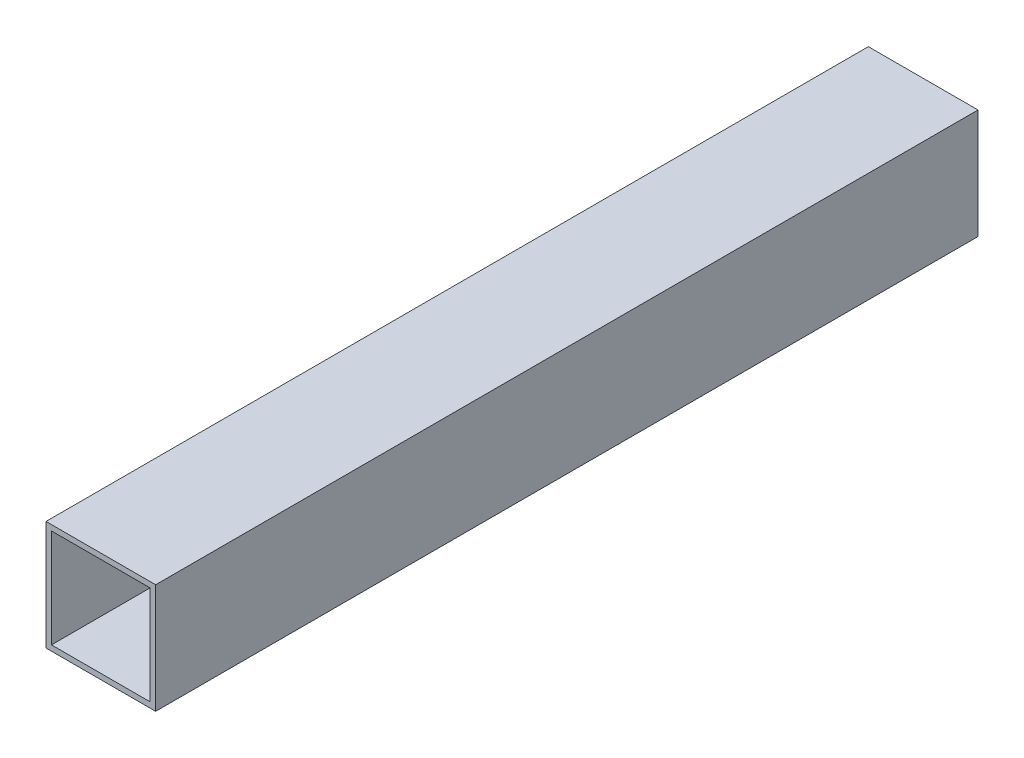
ISO-10303-21;
HEADER;
FILE_DESCRIPTION(('STEP AP214'),'2;1');
FILE_NAME('part.step','',(''),(''),'','','');
FILE_SCHEMA(('AUTOMOTIVE_DESIGN { 1 0 10303 214 1 1 1 1 }'));
ENDSEC;
DATA;
#1=APPLICATION_CONTEXT('core data for automotive mechanical design processes');
#2=APPLICATION_PROTOCOL_DEFINITION('international standard','automotive_design',2000,#1);
#3=PRODUCT_CONTEXT('',#1,'mechanical');
#4=PRODUCT('Part','Part','',(#3));
#5=PRODUCT_RELATED_PRODUCT_CATEGORY('part','',(#4));
#6=PRODUCT_DEFINITION_FORMATION('','',#4);
#7=PRODUCT_DEFINITION_CONTEXT('part definition',#1,'design');
#8=PRODUCT_DEFINITION('design','',#6,#7);
#9=PRODUCT_DEFINITION_SHAPE('','',#8);
#10=(LENGTH_UNIT() NAMED_UNIT(*) SI_UNIT(.MILLI.,.METRE.));
#11=(NAMED_UNIT(*) PLANE_ANGLE_UNIT() SI_UNIT($,.RADIAN.));
#12=(NAMED_UNIT(*) SI_UNIT($,.STERADIAN.) SOLID_ANGLE_UNIT());
#13=UNCERTAINTY_MEASURE_WITH_UNIT(LENGTH_MEASURE(1.E-05),#10,'distance_accuracy_value','');
#14=(GEOMETRIC_REPRESENTATION_CONTEXT(3) GLOBAL_UNCERTAINTY_ASSIGNED_CONTEXT((#13)) GLOBAL_UNIT_ASSIGNED_CONTEXT((#10,
#11,#12)) REPRESENTATION_CONTEXT('',''));
#15=CARTESIAN_POINT('',(0.,0.,0.));
#16=DIRECTION('',(0.,0.,1.));
#17=DIRECTION('',(1.,0.,0.));
#18=AXIS2_PLACEMENT_3D('',#15,#16,#17);
#19=CARTESIAN_POINT('',(0.,0.,150.));
#20=DIRECTION('',(0.,0.,-1.));
#21=DIRECTION('',(-1.,0.,0.));
#22=AXIS2_PLACEMENT_3D('',#19,#20,#21);
#23=PLANE('',#22);
#24=DIRECTION('',(0.,1.,0.));
#25=VECTOR('',#24,1.);
#26=CARTESIAN_POINT('',(10.,-10.,150.));
#27=LINE('',#26,#25);
#28=CARTESIAN_POINT('',(10.,-10.,150.));
#29=VERTEX_POINT('',#28);
#30=CARTESIAN_POINT('',(10.,10.,150.));
#31=VERTEX_POINT('',#30);
#32=EDGE_CURVE('E159',#29,#31,#27,.T.);
#33=ORIENTED_EDGE('',*,*,#32,.T.);
#34=DIRECTION('',(-1.,0.,0.));
#35=VECTOR('',#34,1.);
#36=CARTESIAN_POINT('',(-10.,10.,150.));
#37=LINE('',#36,#35);
#38=CARTESIAN_POINT('',(-10.,10.,150.));
#39=VERTEX_POINT('',#38);
#40=EDGE_CURVE('E163',#31,#39,#37,.T.);
#41=ORIENTED_EDGE('',*,*,#40,.T.);
#42=DIRECTION('',(0.,-1.,0.));
#43=VECTOR('',#42,1.);
#44=CARTESIAN_POINT('',(-10.,-10.,150.));
#45=LINE('',#44,#43);
#46=CARTESIAN_POINT('',(-10.,-10.,150.));
#47=VERTEX_POINT('',#46);
#48=EDGE_CURVE('E167',#39,#47,#45,.T.);
#49=ORIENTED_EDGE('',*,*,#48,.T.);
#50=DIRECTION('',(1.,0.,0.));
#51=VECTOR('',#50,1.);
#52=CARTESIAN_POINT('',(-10.,-10.,150.));
#53=LINE('',#52,#51);
#54=EDGE_CURVE('E170',#47,#29,#53,.T.);
#55=ORIENTED_EDGE('',*,*,#54,.T.);
#56=EDGE_LOOP('',(#33,#41,#49,#55));
#57=FACE_BOUND('',#56,.T.);
#58=DIRECTION('',(0.,-1.,0.));
#59=VECTOR('',#58,1.);
#60=CARTESIAN_POINT('',(-9.,-9.,150.));
#61=LINE('',#60,#59);
#62=CARTESIAN_POINT('',(-9.,9.,150.));
#63=VERTEX_POINT('',#62);
#64=CARTESIAN_POINT('',(-9.,-9.,150.));
#65=VERTEX_POINT('',#64);
#66=EDGE_CURVE('E111',#63,#65,#61,.T.);
#67=ORIENTED_EDGE('',*,*,#66,.F.);
#68=DIRECTION('',(-1.,0.,0.));
#69=VECTOR('',#68,1.);
#70=CARTESIAN_POINT('',(-9.,9.,150.));
#71=LINE('',#70,#69);
#72=CARTESIAN_POINT('',(9.,9.,150.));
#73=VERTEX_POINT('',#72);
#74=EDGE_CURVE('E137',#73,#63,#71,.T.);
#75=ORIENTED_EDGE('',*,*,#74,.F.);
#76=DIRECTION('',(0.,1.,0.));
#77=VECTOR('',#76,1.);
#78=CARTESIAN_POINT('',(9.,-9.,150.));
#79=LINE('',#78,#77);
#80=CARTESIAN_POINT('',(9.,-9.,150.));
#81=VERTEX_POINT('',#80);
#82=EDGE_CURVE('E133',#81,#73,#79,.T.);
#83=ORIENTED_EDGE('',*,*,#82,.F.);
#84=DIRECTION('',(1.,0.,0.));
#85=VECTOR('',#84,1.);
#86=CARTESIAN_POINT('',(-9.,-9.,150.));
#87=LINE('',#86,#85);
#88=EDGE_CURVE('E120',#65,#81,#87,.T.);
#89=ORIENTED_EDGE('',*,*,#88,.F.);
#90=EDGE_LOOP('',(#67,#75,#83,#89));
#91=FACE_BOUND('',#90,.T.);
#92=ADVANCED_FACE('F45',(#57,#91),#23,.F.);
#93=CARTESIAN_POINT('',(0.,0.,0.));
#94=DIRECTION('',(0.,0.,-1.));
#95=DIRECTION('',(-1.,0.,0.));
#96=AXIS2_PLACEMENT_3D('',#93,#94,#95);
#97=PLANE('',#96);
#98=DIRECTION('',(0.,1.,0.));
#99=VECTOR('',#98,1.);
#100=CARTESIAN_POINT('',(10.,-10.,0.));
#101=LINE('',#100,#99);
#102=CARTESIAN_POINT('',(10.,-10.,0.));
#103=VERTEX_POINT('',#102);
#104=CARTESIAN_POINT('',(10.,10.,0.));
#105=VERTEX_POINT('',#104);
#106=EDGE_CURVE('E129',#103,#105,#101,.T.);
#107=ORIENTED_EDGE('',*,*,#106,.F.);
#108=DIRECTION('',(1.,0.,0.));
#109=VECTOR('',#108,1.);
#110=CARTESIAN_POINT('',(-10.,-10.,0.));
#111=LINE('',#110,#109);
#112=CARTESIAN_POINT('',(-10.,-10.,0.));
#113=VERTEX_POINT('',#112);
#114=EDGE_CURVE('E164',#113,#103,#111,.T.);
#115=ORIENTED_EDGE('',*,*,#114,.F.);
#116=DIRECTION('',(0.,-1.,0.));
#117=VECTOR('',#116,1.);
#118=CARTESIAN_POINT('',(-10.,-10.,0.));
#119=LINE('',#118,#117);
#120=CARTESIAN_POINT('',(-10.,10.,0.));
#121=VERTEX_POINT('',#120);
#122=EDGE_CURVE('E180',#121,#113,#119,.T.);
#123=ORIENTED_EDGE('',*,*,#122,.F.);
#124=DIRECTION('',(-1.,0.,0.));
#125=VECTOR('',#124,1.);
#126=CARTESIAN_POINT('',(-10.,10.,0.));
#127=LINE('',#126,#125);
#128=EDGE_CURVE('E177',#105,#121,#127,.T.);
#129=ORIENTED_EDGE('',*,*,#128,.F.);
#130=EDGE_LOOP('',(#107,#115,#123,#129));
#131=FACE_BOUND('',#130,.T.);
#132=DIRECTION('',(-1.,0.,0.));
#133=VECTOR('',#132,1.);
#134=CARTESIAN_POINT('',(-9.,9.,0.));
#135=LINE('',#134,#133);
#136=CARTESIAN_POINT('',(9.,9.,0.));
#137=VERTEX_POINT('',#136);
#138=CARTESIAN_POINT('',(-9.,9.,0.));
#139=VERTEX_POINT('',#138);
#140=EDGE_CURVE('E121',#137,#139,#135,.T.);
#141=ORIENTED_EDGE('',*,*,#140,.T.);
#142=DIRECTION('',(0.,-1.,0.));
#143=VECTOR('',#142,1.);
#144=CARTESIAN_POINT('',(-9.,-9.,0.));
#145=LINE('',#144,#143);
#146=CARTESIAN_POINT('',(-9.,-9.,0.));
#147=VERTEX_POINT('',#146);
#148=EDGE_CURVE('E69',#139,#147,#145,.T.);
#149=ORIENTED_EDGE('',*,*,#148,.T.);
#150=DIRECTION('',(1.,0.,0.));
#151=VECTOR('',#150,1.);
#152=CARTESIAN_POINT('',(-9.,-9.,0.));
#153=LINE('',#152,#151);
#154=CARTESIAN_POINT('',(9.,-9.,0.));
#155=VERTEX_POINT('',#154);
#156=EDGE_CURVE('E127',#147,#155,#153,.T.);
#157=ORIENTED_EDGE('',*,*,#156,.T.);
#158=DIRECTION('',(0.,1.,0.));
#159=VECTOR('',#158,1.);
#160=CARTESIAN_POINT('',(9.,-9.,0.));
#161=LINE('',#160,#159);
#162=EDGE_CURVE('E146',#155,#137,#161,.T.);
#163=ORIENTED_EDGE('',*,*,#162,.T.);
#164=EDGE_LOOP('',(#141,#149,#157,#163));
#165=FACE_BOUND('',#164,.T.);
#166=ADVANCED_FACE('F203',(#131,#165),#97,.T.);
#167=CARTESIAN_POINT('',(10.,-10.,150.));
#168=DIRECTION('',(-1.,0.,0.));
#169=DIRECTION('',(0.,0.,1.));
#170=AXIS2_PLACEMENT_3D('',#167,#168,#169);
#171=PLANE('',#170);
#172=ORIENTED_EDGE('',*,*,#106,.T.);
#173=DIRECTION('',(0.,0.,-1.));
#174=VECTOR('',#173,1.);
#175=CARTESIAN_POINT('',(10.,10.,150.));
#176=LINE('',#175,#174);
#177=EDGE_CURVE('E11',#31,#105,#176,.T.);
#178=ORIENTED_EDGE('',*,*,#177,.F.);
#179=ORIENTED_EDGE('',*,*,#32,.F.);
#180=DIRECTION('',(0.,0.,-1.));
#181=VECTOR('',#180,1.);
#182=CARTESIAN_POINT('',(10.,-10.,150.));
#183=LINE('',#182,#181);
#184=EDGE_CURVE('E173',#29,#103,#183,.T.);
#185=ORIENTED_EDGE('',*,*,#184,.T.);
#186=EDGE_LOOP('',(#172,#178,#179,#185));
#187=FACE_BOUND('',#186,.T.);
#188=ADVANCED_FACE('F47',(#187),#171,.F.);
#189=CARTESIAN_POINT('',(-10.,10.,150.));
#190=DIRECTION('',(0.,-1.,0.));
#191=DIRECTION('',(0.,0.,-1.));
#192=AXIS2_PLACEMENT_3D('',#189,#190,#191);
#193=PLANE('',#192);
#194=ORIENTED_EDGE('',*,*,#128,.T.);
#195=DIRECTION('',(0.,0.,-1.));
#196=VECTOR('',#195,1.);
#197=CARTESIAN_POINT('',(-10.,10.,150.));
#198=LINE('',#197,#196);
#199=EDGE_CURVE('E54',#39,#121,#198,.T.);
#200=ORIENTED_EDGE('',*,*,#199,.F.);
#201=ORIENTED_EDGE('',*,*,#40,.F.);
#202=ORIENTED_EDGE('',*,*,#177,.T.);
#203=EDGE_LOOP('',(#194,#200,#201,#202));
#204=FACE_BOUND('',#203,.T.);
#205=ADVANCED_FACE('F213',(#204),#193,.F.);
#206=CARTESIAN_POINT('',(-10.,-10.,150.));
#207=DIRECTION('',(1.,0.,0.));
#208=DIRECTION('',(0.,0.,-1.));
#209=AXIS2_PLACEMENT_3D('',#206,#207,#208);
#210=PLANE('',#209);
#211=ORIENTED_EDGE('',*,*,#122,.T.);
#212=DIRECTION('',(0.,0.,-1.));
#213=VECTOR('',#212,1.);
#214=CARTESIAN_POINT('',(-10.,-10.,150.));
#215=LINE('',#214,#213);
#216=EDGE_CURVE('E188',#47,#113,#215,.T.);
#217=ORIENTED_EDGE('',*,*,#216,.F.);
#218=ORIENTED_EDGE('',*,*,#48,.F.);
#219=ORIENTED_EDGE('',*,*,#199,.T.);
#220=EDGE_LOOP('',(#211,#217,#218,#219));
#221=FACE_BOUND('',#220,.T.);
#222=ADVANCED_FACE('F197',(#221),#210,.F.);
#223=CARTESIAN_POINT('',(-10.,-10.,150.));
#224=DIRECTION('',(0.,1.,0.));
#225=DIRECTION('',(0.,0.,1.));
#226=AXIS2_PLACEMENT_3D('',#223,#224,#225);
#227=PLANE('',#226);
#228=ORIENTED_EDGE('',*,*,#114,.T.);
#229=ORIENTED_EDGE('',*,*,#184,.F.);
#230=ORIENTED_EDGE('',*,*,#54,.F.);
#231=ORIENTED_EDGE('',*,*,#216,.T.);
#232=EDGE_LOOP('',(#228,#229,#230,#231));
#233=FACE_BOUND('',#232,.T.);
#234=ADVANCED_FACE('F207',(#233),#227,.F.);
#235=CARTESIAN_POINT('',(-9.,-9.,150.));
#236=DIRECTION('',(1.,0.,0.));
#237=DIRECTION('',(0.,0.,-1.));
#238=AXIS2_PLACEMENT_3D('',#235,#236,#237);
#239=PLANE('',#238);
#240=ORIENTED_EDGE('',*,*,#148,.F.);
#241=DIRECTION('',(0.,0.,-1.));
#242=VECTOR('',#241,1.);
#243=CARTESIAN_POINT('',(-9.,9.,150.));
#244=LINE('',#243,#242);
#245=EDGE_CURVE('E115',#63,#139,#244,.T.);
#246=ORIENTED_EDGE('',*,*,#245,.F.);
#247=ORIENTED_EDGE('',*,*,#66,.T.);
#248=DIRECTION('',(0.,0.,-1.));
#249=VECTOR('',#248,1.);
#250=CARTESIAN_POINT('',(-9.,-9.,150.));
#251=LINE('',#250,#249);
#252=EDGE_CURVE('E114',#65,#147,#251,.T.);
#253=ORIENTED_EDGE('',*,*,#252,.T.);
#254=EDGE_LOOP('',(#240,#246,#247,#253));
#255=FACE_BOUND('',#254,.T.);
#256=ADVANCED_FACE('F113',(#255),#239,.T.);
#257=CARTESIAN_POINT('',(-9.,-9.,150.));
#258=DIRECTION('',(0.,1.,0.));
#259=DIRECTION('',(0.,0.,1.));
#260=AXIS2_PLACEMENT_3D('',#257,#258,#259);
#261=PLANE('',#260);
#262=ORIENTED_EDGE('',*,*,#156,.F.);
#263=ORIENTED_EDGE('',*,*,#252,.F.);
#264=ORIENTED_EDGE('',*,*,#88,.T.);
#265=DIRECTION('',(0.,0.,-1.));
#266=VECTOR('',#265,1.);
#267=CARTESIAN_POINT('',(9.,-9.,150.));
#268=LINE('',#267,#266);
#269=EDGE_CURVE('E130',#81,#155,#268,.T.);
#270=ORIENTED_EDGE('',*,*,#269,.T.);
#271=EDGE_LOOP('',(#262,#263,#264,#270));
#272=FACE_BOUND('',#271,.T.);
#273=ADVANCED_FACE('F124',(#272),#261,.T.);
#274=CARTESIAN_POINT('',(9.,-9.,150.));
#275=DIRECTION('',(-1.,0.,0.));
#276=DIRECTION('',(0.,-1.,0.));
#277=AXIS2_PLACEMENT_3D('',#274,#275,#276);
#278=PLANE('',#277);
#279=ORIENTED_EDGE('',*,*,#162,.F.);
#280=ORIENTED_EDGE('',*,*,#269,.F.);
#281=ORIENTED_EDGE('',*,*,#82,.T.);
#282=DIRECTION('',(0.,0.,-1.));
#283=VECTOR('',#282,1.);
#284=CARTESIAN_POINT('',(9.,9.,150.));
#285=LINE('',#284,#283);
#286=EDGE_CURVE('E61',#73,#137,#285,.T.);
#287=ORIENTED_EDGE('',*,*,#286,.T.);
#288=EDGE_LOOP('',(#279,#280,#281,#287));
#289=FACE_BOUND('',#288,.T.);
#290=ADVANCED_FACE('F236',(#289),#278,.T.);
#291=CARTESIAN_POINT('',(-9.,9.,150.));
#292=DIRECTION('',(0.,-1.,0.));
#293=DIRECTION('',(0.,0.,-1.));
#294=AXIS2_PLACEMENT_3D('',#291,#292,#293);
#295=PLANE('',#294);
#296=ORIENTED_EDGE('',*,*,#140,.F.);
#297=ORIENTED_EDGE('',*,*,#286,.F.);
#298=ORIENTED_EDGE('',*,*,#74,.T.);
#299=ORIENTED_EDGE('',*,*,#245,.T.);
#300=EDGE_LOOP('',(#296,#297,#298,#299));
#301=FACE_BOUND('',#300,.T.);
#302=ADVANCED_FACE('F240',(#301),#295,.T.);
#303=CLOSED_SHELL('',(#92,#166,#188,#205,#222,#234,#256,#273,#290,#302));
#304=MANIFOLD_SOLID_BREP('B2',#303);
#305=ADVANCED_BREP_SHAPE_REPRESENTATION('',(#18,#304),#14);
#306=SHAPE_DEFINITION_REPRESENTATION(#9,#305);
ENDSEC;
END-ISO-10303-21;
